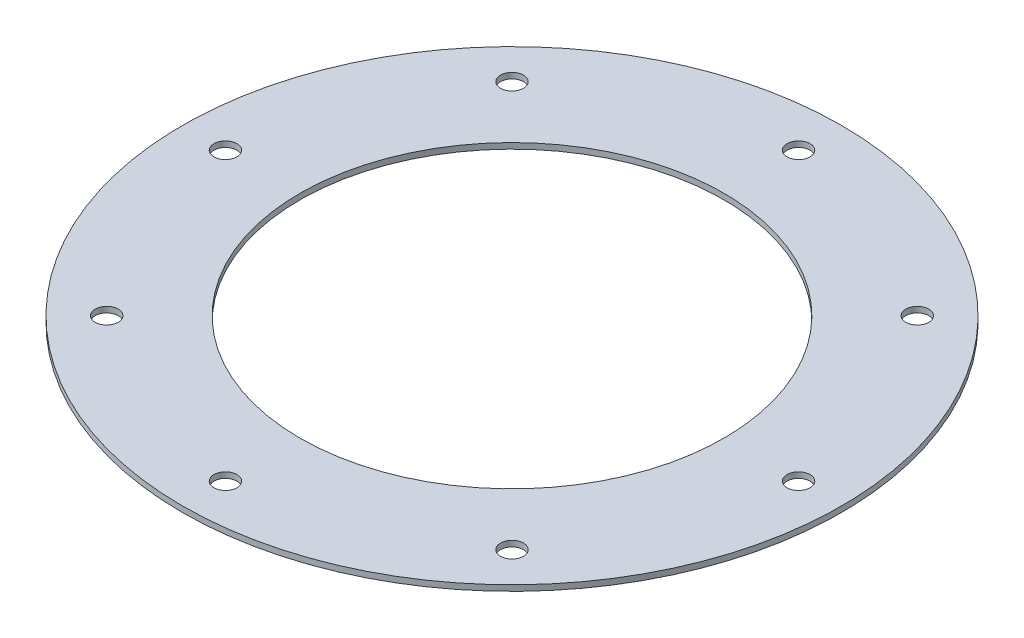
ISO-10303-21;
HEADER;
FILE_DESCRIPTION(('STEP AP214'),'2;1');
FILE_NAME('part.step','',(''),(''),'','','');
FILE_SCHEMA(('AUTOMOTIVE_DESIGN { 1 0 10303 214 1 1 1 1 }'));
ENDSEC;
DATA;
#1=APPLICATION_CONTEXT('core data for automotive mechanical design processes');
#2=APPLICATION_PROTOCOL_DEFINITION('international standard','automotive_design',2000,#1);
#3=PRODUCT_CONTEXT('',#1,'mechanical');
#4=PRODUCT('Part','Part','',(#3));
#5=PRODUCT_RELATED_PRODUCT_CATEGORY('part','',(#4));
#6=PRODUCT_DEFINITION_FORMATION('','',#4);
#7=PRODUCT_DEFINITION_CONTEXT('part definition',#1,'design');
#8=PRODUCT_DEFINITION('design','',#6,#7);
#9=PRODUCT_DEFINITION_SHAPE('','',#8);
#10=(LENGTH_UNIT() NAMED_UNIT(*) SI_UNIT(.MILLI.,.METRE.));
#11=(NAMED_UNIT(*) PLANE_ANGLE_UNIT() SI_UNIT($,.RADIAN.));
#12=(NAMED_UNIT(*) SI_UNIT($,.STERADIAN.) SOLID_ANGLE_UNIT());
#13=UNCERTAINTY_MEASURE_WITH_UNIT(LENGTH_MEASURE(1.E-05),#10,'distance_accuracy_value','');
#14=(GEOMETRIC_REPRESENTATION_CONTEXT(3) GLOBAL_UNCERTAINTY_ASSIGNED_CONTEXT((#13)) GLOBAL_UNIT_ASSIGNED_CONTEXT((#10,
#11,#12)) REPRESENTATION_CONTEXT('',''));
#15=CARTESIAN_POINT('',(0.,0.,0.));
#16=DIRECTION('',(0.,0.,1.));
#17=DIRECTION('',(1.,0.,0.));
#18=AXIS2_PLACEMENT_3D('',#15,#16,#17);
#19=CARTESIAN_POINT('',(0.,2.,0.));
#20=DIRECTION('',(0.,1.,0.));
#21=DIRECTION('',(0.,0.,1.));
#22=AXIS2_PLACEMENT_3D('',#19,#20,#21);
#23=PLANE('',#22);
#24=CARTESIAN_POINT('',(0.,2.,100.));
#25=DIRECTION('',(0.,1.,0.));
#26=DIRECTION('',(0.,0.,1.));
#27=AXIS2_PLACEMENT_3D('',#24,#25,#26);
#28=CIRCLE('',#27,4.00000000000001);
#29=CARTESIAN_POINT('',(0.,2.,104.));
#30=VERTEX_POINT('',#29);
#31=EDGE_CURVE('E104',#30,#30,#28,.T.);
#32=ORIENTED_EDGE('',*,*,#31,.F.);
#33=EDGE_LOOP('',(#32));
#34=FACE_BOUND('',#33,.T.);
#35=CARTESIAN_POINT('',(100.,2.,0.));
#36=DIRECTION('',(0.,1.,0.));
#37=DIRECTION('',(0.,0.,1.));
#38=AXIS2_PLACEMENT_3D('',#35,#36,#37);
#39=CIRCLE('',#38,4.00000000000002);
#40=CARTESIAN_POINT('',(100.,2.,3.99999999999999));
#41=VERTEX_POINT('',#40);
#42=EDGE_CURVE('E88',#41,#41,#39,.T.);
#43=ORIENTED_EDGE('',*,*,#42,.F.);
#44=EDGE_LOOP('',(#43));
#45=FACE_BOUND('',#44,.T.);
#46=CARTESIAN_POINT('',(0.,2.,-100.));
#47=DIRECTION('',(0.,1.,0.));
#48=DIRECTION('',(0.,0.,1.));
#49=AXIS2_PLACEMENT_3D('',#46,#47,#48);
#50=CIRCLE('',#49,4.);
#51=CARTESIAN_POINT('',(0.,2.,-96.));
#52=VERTEX_POINT('',#51);
#53=EDGE_CURVE('E72',#52,#52,#50,.T.);
#54=ORIENTED_EDGE('',*,*,#53,.F.);
#55=EDGE_LOOP('',(#54));
#56=FACE_BOUND('',#55,.T.);
#57=CARTESIAN_POINT('',(-100.,2.,0.));
#58=DIRECTION('',(0.,1.,0.));
#59=DIRECTION('',(0.,0.,1.));
#60=AXIS2_PLACEMENT_3D('',#57,#58,#59);
#61=CIRCLE('',#60,4.00000000000001);
#62=CARTESIAN_POINT('',(-100.,2.,4.00000000000002));
#63=VERTEX_POINT('',#62);
#64=EDGE_CURVE('E56',#63,#63,#61,.T.);
#65=ORIENTED_EDGE('',*,*,#64,.F.);
#66=EDGE_LOOP('',(#65));
#67=FACE_BOUND('',#66,.T.);
#68=CARTESIAN_POINT('',(0.,2.,0.));
#69=DIRECTION('',(0.,1.,0.));
#70=DIRECTION('',(0.,0.,1.));
#71=AXIS2_PLACEMENT_3D('',#68,#69,#70);
#72=CIRCLE('',#71,115.);
#73=CARTESIAN_POINT('',(0.,2.,115.));
#74=VERTEX_POINT('',#73);
#75=EDGE_CURVE('E10',#74,#74,#72,.T.);
#76=ORIENTED_EDGE('',*,*,#75,.T.);
#77=EDGE_LOOP('',(#76));
#78=FACE_BOUND('',#77,.T.);
#79=CARTESIAN_POINT('',(0.,2.,0.));
#80=DIRECTION('',(0.,1.,0.));
#81=DIRECTION('',(0.,0.,1.));
#82=AXIS2_PLACEMENT_3D('',#79,#80,#81);
#83=CIRCLE('',#82,74.);
#84=CARTESIAN_POINT('',(0.,2.,74.));
#85=VERTEX_POINT('',#84);
#86=EDGE_CURVE('E50',#85,#85,#83,.T.);
#87=ORIENTED_EDGE('',*,*,#86,.F.);
#88=EDGE_LOOP('',(#87));
#89=FACE_BOUND('',#88,.T.);
#90=CARTESIAN_POINT('',(-70.7106781186548,2.,-70.7106781186548));
#91=DIRECTION('',(0.,1.,0.));
#92=DIRECTION('',(0.,0.,1.));
#93=AXIS2_PLACEMENT_3D('',#90,#91,#92);
#94=CIRCLE('',#93,4.00000000000001);
#95=CARTESIAN_POINT('',(-70.7106781186548,2.,-66.7106781186548));
#96=VERTEX_POINT('',#95);
#97=EDGE_CURVE('E64',#96,#96,#94,.T.);
#98=ORIENTED_EDGE('',*,*,#97,.F.);
#99=EDGE_LOOP('',(#98));
#100=FACE_BOUND('',#99,.T.);
#101=CARTESIAN_POINT('',(70.7106781186547,2.,-70.7106781186548));
#102=DIRECTION('',(0.,1.,0.));
#103=DIRECTION('',(0.,0.,1.));
#104=AXIS2_PLACEMENT_3D('',#101,#102,#103);
#105=CIRCLE('',#104,4.00000000000001);
#106=CARTESIAN_POINT('',(70.7106781186547,2.,-66.7106781186548));
#107=VERTEX_POINT('',#106);
#108=EDGE_CURVE('E80',#107,#107,#105,.T.);
#109=ORIENTED_EDGE('',*,*,#108,.F.);
#110=EDGE_LOOP('',(#109));
#111=FACE_BOUND('',#110,.T.);
#112=CARTESIAN_POINT('',(70.7106781186548,2.,70.7106781186547));
#113=DIRECTION('',(0.,1.,0.));
#114=DIRECTION('',(0.,0.,1.));
#115=AXIS2_PLACEMENT_3D('',#112,#113,#114);
#116=CIRCLE('',#115,4.00000000000002);
#117=CARTESIAN_POINT('',(70.7106781186548,2.,74.7106781186548));
#118=VERTEX_POINT('',#117);
#119=EDGE_CURVE('E96',#118,#118,#116,.T.);
#120=ORIENTED_EDGE('',*,*,#119,.F.);
#121=EDGE_LOOP('',(#120));
#122=FACE_BOUND('',#121,.T.);
#123=CARTESIAN_POINT('',(-70.7106781186547,2.,70.7106781186548));
#124=DIRECTION('',(0.,1.,0.));
#125=DIRECTION('',(0.,0.,1.));
#126=AXIS2_PLACEMENT_3D('',#123,#124,#125);
#127=CIRCLE('',#126,4.00000000000001);
#128=CARTESIAN_POINT('',(-70.7106781186547,2.,74.7106781186548));
#129=VERTEX_POINT('',#128);
#130=EDGE_CURVE('E112',#129,#129,#127,.T.);
#131=ORIENTED_EDGE('',*,*,#130,.F.);
#132=EDGE_LOOP('',(#131));
#133=FACE_BOUND('',#132,.T.);
#134=ADVANCED_FACE('F37',(#34,#45,#56,#67,#78,#89,#100,#111,#122,#133),#23,.T.);
#135=CARTESIAN_POINT('',(0.,0.,0.));
#136=DIRECTION('',(0.,1.,0.));
#137=DIRECTION('',(0.,0.,1.));
#138=AXIS2_PLACEMENT_3D('',#135,#136,#137);
#139=PLANE('',#138);
#140=CARTESIAN_POINT('',(0.,0.,0.));
#141=DIRECTION('',(0.,1.,0.));
#142=DIRECTION('',(0.,0.,1.));
#143=AXIS2_PLACEMENT_3D('',#140,#141,#142);
#144=CIRCLE('',#143,115.);
#145=CARTESIAN_POINT('',(0.,0.,115.));
#146=VERTEX_POINT('',#145);
#147=EDGE_CURVE('E41',#146,#146,#144,.T.);
#148=ORIENTED_EDGE('',*,*,#147,.F.);
#149=EDGE_LOOP('',(#148));
#150=FACE_BOUND('',#149,.T.);
#151=CARTESIAN_POINT('',(0.,0.,0.));
#152=DIRECTION('',(0.,1.,0.));
#153=DIRECTION('',(0.,0.,1.));
#154=AXIS2_PLACEMENT_3D('',#151,#152,#153);
#155=CIRCLE('',#154,74.);
#156=CARTESIAN_POINT('',(0.,0.,74.));
#157=VERTEX_POINT('',#156);
#158=EDGE_CURVE('E52',#157,#157,#155,.T.);
#159=ORIENTED_EDGE('',*,*,#158,.T.);
#160=EDGE_LOOP('',(#159));
#161=FACE_BOUND('',#160,.T.);
#162=CARTESIAN_POINT('',(-100.,0.,0.));
#163=DIRECTION('',(0.,1.,0.));
#164=DIRECTION('',(0.,0.,1.));
#165=AXIS2_PLACEMENT_3D('',#162,#163,#164);
#166=CIRCLE('',#165,4.00000000000001);
#167=CARTESIAN_POINT('',(-100.,0.,4.00000000000002));
#168=VERTEX_POINT('',#167);
#169=EDGE_CURVE('E60',#168,#168,#166,.T.);
#170=ORIENTED_EDGE('',*,*,#169,.T.);
#171=EDGE_LOOP('',(#170));
#172=FACE_BOUND('',#171,.T.);
#173=CARTESIAN_POINT('',(-70.7106781186548,0.,-70.7106781186548));
#174=DIRECTION('',(0.,1.,0.));
#175=DIRECTION('',(0.,0.,1.));
#176=AXIS2_PLACEMENT_3D('',#173,#174,#175);
#177=CIRCLE('',#176,4.00000000000001);
#178=CARTESIAN_POINT('',(-70.7106781186548,0.,-66.7106781186548));
#179=VERTEX_POINT('',#178);
#180=EDGE_CURVE('E68',#179,#179,#177,.T.);
#181=ORIENTED_EDGE('',*,*,#180,.T.);
#182=EDGE_LOOP('',(#181));
#183=FACE_BOUND('',#182,.T.);
#184=CARTESIAN_POINT('',(0.,0.,-100.));
#185=DIRECTION('',(0.,1.,0.));
#186=DIRECTION('',(0.,0.,1.));
#187=AXIS2_PLACEMENT_3D('',#184,#185,#186);
#188=CIRCLE('',#187,4.);
#189=CARTESIAN_POINT('',(0.,0.,-96.));
#190=VERTEX_POINT('',#189);
#191=EDGE_CURVE('E76',#190,#190,#188,.T.);
#192=ORIENTED_EDGE('',*,*,#191,.T.);
#193=EDGE_LOOP('',(#192));
#194=FACE_BOUND('',#193,.T.);
#195=CARTESIAN_POINT('',(70.7106781186547,0.,-70.7106781186548));
#196=DIRECTION('',(0.,1.,0.));
#197=DIRECTION('',(0.,0.,1.));
#198=AXIS2_PLACEMENT_3D('',#195,#196,#197);
#199=CIRCLE('',#198,4.00000000000001);
#200=CARTESIAN_POINT('',(70.7106781186547,0.,-66.7106781186548));
#201=VERTEX_POINT('',#200);
#202=EDGE_CURVE('E84',#201,#201,#199,.T.);
#203=ORIENTED_EDGE('',*,*,#202,.T.);
#204=EDGE_LOOP('',(#203));
#205=FACE_BOUND('',#204,.T.);
#206=CARTESIAN_POINT('',(100.,0.,0.));
#207=DIRECTION('',(0.,1.,0.));
#208=DIRECTION('',(0.,0.,1.));
#209=AXIS2_PLACEMENT_3D('',#206,#207,#208);
#210=CIRCLE('',#209,4.00000000000002);
#211=CARTESIAN_POINT('',(100.,0.,3.99999999999999));
#212=VERTEX_POINT('',#211);
#213=EDGE_CURVE('E92',#212,#212,#210,.T.);
#214=ORIENTED_EDGE('',*,*,#213,.T.);
#215=EDGE_LOOP('',(#214));
#216=FACE_BOUND('',#215,.T.);
#217=CARTESIAN_POINT('',(70.7106781186548,0.,70.7106781186547));
#218=DIRECTION('',(0.,1.,0.));
#219=DIRECTION('',(0.,0.,1.));
#220=AXIS2_PLACEMENT_3D('',#217,#218,#219);
#221=CIRCLE('',#220,4.00000000000002);
#222=CARTESIAN_POINT('',(70.7106781186548,0.,74.7106781186548));
#223=VERTEX_POINT('',#222);
#224=EDGE_CURVE('E100',#223,#223,#221,.T.);
#225=ORIENTED_EDGE('',*,*,#224,.T.);
#226=EDGE_LOOP('',(#225));
#227=FACE_BOUND('',#226,.T.);
#228=CARTESIAN_POINT('',(0.,0.,100.));
#229=DIRECTION('',(0.,1.,0.));
#230=DIRECTION('',(0.,0.,1.));
#231=AXIS2_PLACEMENT_3D('',#228,#229,#230);
#232=CIRCLE('',#231,4.00000000000001);
#233=CARTESIAN_POINT('',(0.,0.,104.));
#234=VERTEX_POINT('',#233);
#235=EDGE_CURVE('E108',#234,#234,#232,.T.);
#236=ORIENTED_EDGE('',*,*,#235,.T.);
#237=EDGE_LOOP('',(#236));
#238=FACE_BOUND('',#237,.T.);
#239=CARTESIAN_POINT('',(-70.7106781186547,0.,70.7106781186548));
#240=DIRECTION('',(0.,1.,0.));
#241=DIRECTION('',(0.,0.,1.));
#242=AXIS2_PLACEMENT_3D('',#239,#240,#241);
#243=CIRCLE('',#242,4.00000000000001);
#244=CARTESIAN_POINT('',(-70.7106781186547,0.,74.7106781186548));
#245=VERTEX_POINT('',#244);
#246=EDGE_CURVE('E116',#245,#245,#243,.T.);
#247=ORIENTED_EDGE('',*,*,#246,.T.);
#248=EDGE_LOOP('',(#247));
#249=FACE_BOUND('',#248,.T.);
#250=ADVANCED_FACE('F128',(#150,#161,#172,#183,#194,#205,#216,#227,#238,#249),#139,.F.);
#251=CARTESIAN_POINT('',(0.,2.,0.));
#252=DIRECTION('',(0.,-1.,0.));
#253=DIRECTION('',(0.,0.,-1.));
#254=AXIS2_PLACEMENT_3D('',#251,#252,#253);
#255=CYLINDRICAL_SURFACE('',#254,115.);
#256=ORIENTED_EDGE('',*,*,#75,.F.);
#257=EDGE_LOOP('',(#256));
#258=FACE_BOUND('',#257,.T.);
#259=ORIENTED_EDGE('',*,*,#147,.T.);
#260=EDGE_LOOP('',(#259));
#261=FACE_BOUND('',#260,.T.);
#262=ADVANCED_FACE('F39',(#258,#261),#255,.T.);
#263=CARTESIAN_POINT('',(0.,2.,0.));
#264=DIRECTION('',(0.,-1.,0.));
#265=DIRECTION('',(0.,0.,-1.));
#266=AXIS2_PLACEMENT_3D('',#263,#264,#265);
#267=CYLINDRICAL_SURFACE('',#266,74.);
#268=ORIENTED_EDGE('',*,*,#86,.T.);
#269=EDGE_LOOP('',(#268));
#270=FACE_BOUND('',#269,.T.);
#271=ORIENTED_EDGE('',*,*,#158,.F.);
#272=EDGE_LOOP('',(#271));
#273=FACE_BOUND('',#272,.T.);
#274=ADVANCED_FACE('F138',(#270,#273),#267,.F.);
#275=CARTESIAN_POINT('',(-100.,2.,0.));
#276=DIRECTION('',(0.,-1.,0.));
#277=DIRECTION('',(0.,0.,-1.));
#278=AXIS2_PLACEMENT_3D('',#275,#276,#277);
#279=CYLINDRICAL_SURFACE('',#278,4.00000000000001);
#280=ORIENTED_EDGE('',*,*,#64,.T.);
#281=EDGE_LOOP('',(#280));
#282=FACE_BOUND('',#281,.T.);
#283=ORIENTED_EDGE('',*,*,#169,.F.);
#284=EDGE_LOOP('',(#283));
#285=FACE_BOUND('',#284,.T.);
#286=ADVANCED_FACE('F141',(#282,#285),#279,.F.);
#287=CARTESIAN_POINT('',(-70.7106781186548,2.,-70.7106781186548));
#288=DIRECTION('',(0.,-1.,0.));
#289=DIRECTION('',(0.,0.,-1.));
#290=AXIS2_PLACEMENT_3D('',#287,#288,#289);
#291=CYLINDRICAL_SURFACE('',#290,4.00000000000001);
#292=ORIENTED_EDGE('',*,*,#97,.T.);
#293=EDGE_LOOP('',(#292));
#294=FACE_BOUND('',#293,.T.);
#295=ORIENTED_EDGE('',*,*,#180,.F.);
#296=EDGE_LOOP('',(#295));
#297=FACE_BOUND('',#296,.T.);
#298=ADVANCED_FACE('F145',(#294,#297),#291,.F.);
#299=CARTESIAN_POINT('',(0.,2.,-100.));
#300=DIRECTION('',(0.,-1.,0.));
#301=DIRECTION('',(0.,0.,-1.));
#302=AXIS2_PLACEMENT_3D('',#299,#300,#301);
#303=CYLINDRICAL_SURFACE('',#302,4.);
#304=ORIENTED_EDGE('',*,*,#53,.T.);
#305=EDGE_LOOP('',(#304));
#306=FACE_BOUND('',#305,.T.);
#307=ORIENTED_EDGE('',*,*,#191,.F.);
#308=EDGE_LOOP('',(#307));
#309=FACE_BOUND('',#308,.T.);
#310=ADVANCED_FACE('F149',(#306,#309),#303,.F.);
#311=CARTESIAN_POINT('',(70.7106781186547,2.,-70.7106781186548));
#312=DIRECTION('',(0.,-1.,0.));
#313=DIRECTION('',(0.,0.,-1.));
#314=AXIS2_PLACEMENT_3D('',#311,#312,#313);
#315=CYLINDRICAL_SURFACE('',#314,4.00000000000001);
#316=ORIENTED_EDGE('',*,*,#108,.T.);
#317=EDGE_LOOP('',(#316));
#318=FACE_BOUND('',#317,.T.);
#319=ORIENTED_EDGE('',*,*,#202,.F.);
#320=EDGE_LOOP('',(#319));
#321=FACE_BOUND('',#320,.T.);
#322=ADVANCED_FACE('F153',(#318,#321),#315,.F.);
#323=CARTESIAN_POINT('',(100.,2.,0.));
#324=DIRECTION('',(0.,-1.,0.));
#325=DIRECTION('',(0.,0.,-1.));
#326=AXIS2_PLACEMENT_3D('',#323,#324,#325);
#327=CYLINDRICAL_SURFACE('',#326,4.00000000000002);
#328=ORIENTED_EDGE('',*,*,#42,.T.);
#329=EDGE_LOOP('',(#328));
#330=FACE_BOUND('',#329,.T.);
#331=ORIENTED_EDGE('',*,*,#213,.F.);
#332=EDGE_LOOP('',(#331));
#333=FACE_BOUND('',#332,.T.);
#334=ADVANCED_FACE('F157',(#330,#333),#327,.F.);
#335=CARTESIAN_POINT('',(70.7106781186548,2.,70.7106781186547));
#336=DIRECTION('',(0.,-1.,0.));
#337=DIRECTION('',(0.,0.,-1.));
#338=AXIS2_PLACEMENT_3D('',#335,#336,#337);
#339=CYLINDRICAL_SURFACE('',#338,4.00000000000002);
#340=ORIENTED_EDGE('',*,*,#119,.T.);
#341=EDGE_LOOP('',(#340));
#342=FACE_BOUND('',#341,.T.);
#343=ORIENTED_EDGE('',*,*,#224,.F.);
#344=EDGE_LOOP('',(#343));
#345=FACE_BOUND('',#344,.T.);
#346=ADVANCED_FACE('F161',(#342,#345),#339,.F.);
#347=CARTESIAN_POINT('',(0.,2.,100.));
#348=DIRECTION('',(0.,-1.,0.));
#349=DIRECTION('',(0.,0.,-1.));
#350=AXIS2_PLACEMENT_3D('',#347,#348,#349);
#351=CYLINDRICAL_SURFACE('',#350,4.00000000000001);
#352=ORIENTED_EDGE('',*,*,#31,.T.);
#353=EDGE_LOOP('',(#352));
#354=FACE_BOUND('',#353,.T.);
#355=ORIENTED_EDGE('',*,*,#235,.F.);
#356=EDGE_LOOP('',(#355));
#357=FACE_BOUND('',#356,.T.);
#358=ADVANCED_FACE('F165',(#354,#357),#351,.F.);
#359=CARTESIAN_POINT('',(-70.7106781186547,2.,70.7106781186548));
#360=DIRECTION('',(0.,-1.,0.));
#361=DIRECTION('',(0.,0.,-1.));
#362=AXIS2_PLACEMENT_3D('',#359,#360,#361);
#363=CYLINDRICAL_SURFACE('',#362,4.00000000000001);
#364=ORIENTED_EDGE('',*,*,#130,.T.);
#365=EDGE_LOOP('',(#364));
#366=FACE_BOUND('',#365,.T.);
#367=ORIENTED_EDGE('',*,*,#246,.F.);
#368=EDGE_LOOP('',(#367));
#369=FACE_BOUND('',#368,.T.);
#370=ADVANCED_FACE('F124',(#366,#369),#363,.F.);
#371=CLOSED_SHELL('',(#134,#250,#262,#274,#286,#298,#310,#322,#334,#346,#358,#370));
#372=MANIFOLD_SOLID_BREP('B2',#371);
#373=ADVANCED_BREP_SHAPE_REPRESENTATION('',(#18,#372),#14);
#374=SHAPE_DEFINITION_REPRESENTATION(#9,#373);
ENDSEC;
END-ISO-10303-21;
